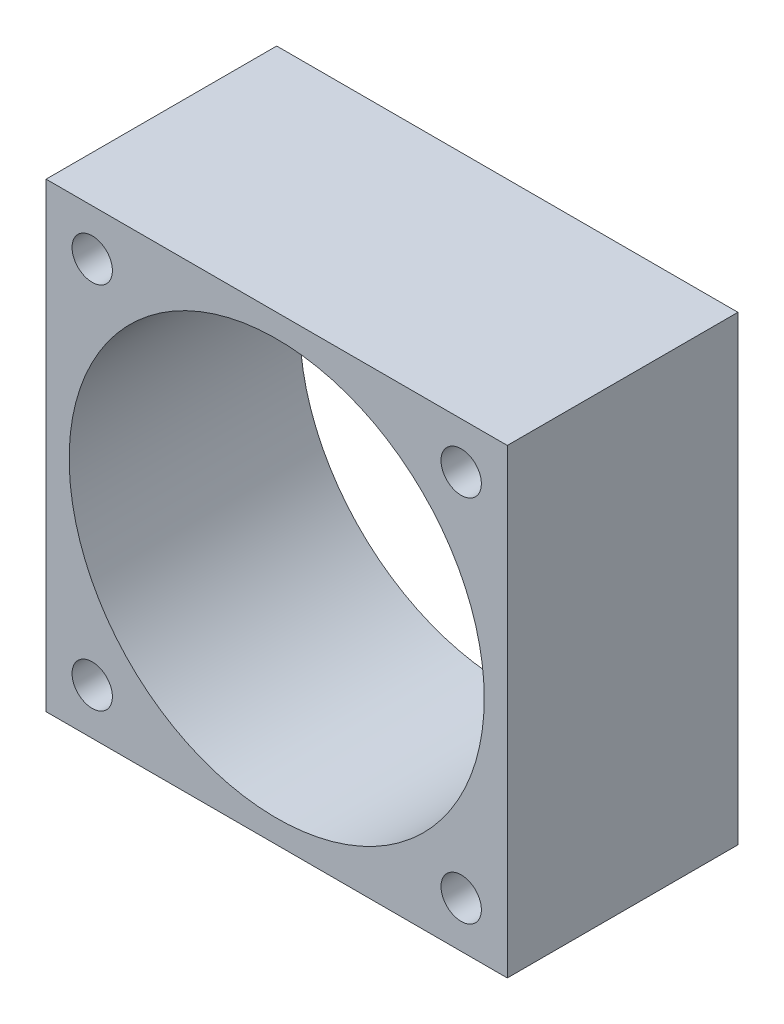
ISO-10303-21;
HEADER;
FILE_DESCRIPTION(('STEP AP214'),'2;1');
FILE_NAME('part.step','',(''),(''),'','','');
FILE_SCHEMA(('AUTOMOTIVE_DESIGN { 1 0 10303 214 1 1 1 1 }'));
ENDSEC;
DATA;
#1=APPLICATION_CONTEXT('core data for automotive mechanical design processes');
#2=APPLICATION_PROTOCOL_DEFINITION('international standard','automotive_design',2000,#1);
#3=PRODUCT_CONTEXT('',#1,'mechanical');
#4=PRODUCT('Part','Part','',(#3));
#5=PRODUCT_RELATED_PRODUCT_CATEGORY('part','',(#4));
#6=PRODUCT_DEFINITION_FORMATION('','',#4);
#7=PRODUCT_DEFINITION_CONTEXT('part definition',#1,'design');
#8=PRODUCT_DEFINITION('design','',#6,#7);
#9=PRODUCT_DEFINITION_SHAPE('','',#8);
#10=(LENGTH_UNIT() NAMED_UNIT(*) SI_UNIT(.MILLI.,.METRE.));
#11=(NAMED_UNIT(*) PLANE_ANGLE_UNIT() SI_UNIT($,.RADIAN.));
#12=(NAMED_UNIT(*) SI_UNIT($,.STERADIAN.) SOLID_ANGLE_UNIT());
#13=UNCERTAINTY_MEASURE_WITH_UNIT(LENGTH_MEASURE(1.E-05),#10,'distance_accuracy_value','');
#14=(GEOMETRIC_REPRESENTATION_CONTEXT(3) GLOBAL_UNCERTAINTY_ASSIGNED_CONTEXT((#13)) GLOBAL_UNIT_ASSIGNED_CONTEXT((#10,
#11,#12)) REPRESENTATION_CONTEXT('',''));
#15=CARTESIAN_POINT('',(0.,0.,0.));
#16=DIRECTION('',(0.,0.,1.));
#17=DIRECTION('',(1.,0.,0.));
#18=AXIS2_PLACEMENT_3D('',#15,#16,#17);
#19=CARTESIAN_POINT('',(0.,0.,20.));
#20=DIRECTION('',(0.,0.,-1.));
#21=DIRECTION('',(-1.,0.,0.));
#22=AXIS2_PLACEMENT_3D('',#19,#20,#21);
#23=PLANE('',#22);
#24=DIRECTION('',(0.,-1.,0.));
#25=VECTOR('',#24,1.);
#26=CARTESIAN_POINT('',(-30.,33.,20.));
#27=LINE('',#26,#25);
#28=CARTESIAN_POINT('',(-30.,73.,20.));
#29=VERTEX_POINT('',#28);
#30=CARTESIAN_POINT('',(-30.,33.,20.));
#31=VERTEX_POINT('',#30);
#32=EDGE_CURVE('E94',#29,#31,#27,.T.);
#33=ORIENTED_EDGE('',*,*,#32,.T.);
#34=DIRECTION('',(1.,0.,0.));
#35=VECTOR('',#34,1.);
#36=CARTESIAN_POINT('',(-30.,33.,20.));
#37=LINE('',#36,#35);
#38=CARTESIAN_POINT('',(10.,33.,20.));
#39=VERTEX_POINT('',#38);
#40=EDGE_CURVE('E90',#31,#39,#37,.T.);
#41=ORIENTED_EDGE('',*,*,#40,.T.);
#42=DIRECTION('',(0.,1.,0.));
#43=VECTOR('',#42,1.);
#44=CARTESIAN_POINT('',(10.,33.,20.));
#45=LINE('',#44,#43);
#46=CARTESIAN_POINT('',(10.,73.,20.));
#47=VERTEX_POINT('',#46);
#48=EDGE_CURVE('E92',#39,#47,#45,.T.);
#49=ORIENTED_EDGE('',*,*,#48,.T.);
#50=DIRECTION('',(-1.,0.,0.));
#51=VECTOR('',#50,1.);
#52=CARTESIAN_POINT('',(-30.,73.,20.));
#53=LINE('',#52,#51);
#54=EDGE_CURVE('E59',#47,#29,#53,.T.);
#55=ORIENTED_EDGE('',*,*,#54,.T.);
#56=EDGE_LOOP('',(#33,#41,#49,#55));
#57=FACE_BOUND('',#56,.T.);
#58=CARTESIAN_POINT('',(-10.,53.,20.));
#59=DIRECTION('',(0.,0.,1.));
#60=DIRECTION('',(1.,0.,0.));
#61=AXIS2_PLACEMENT_3D('',#58,#59,#60);
#62=CIRCLE('',#61,18.);
#63=CARTESIAN_POINT('',(8.,53.,20.));
#64=VERTEX_POINT('',#63);
#65=EDGE_CURVE('E108',#64,#64,#62,.T.);
#66=ORIENTED_EDGE('',*,*,#65,.F.);
#67=EDGE_LOOP('',(#66));
#68=FACE_BOUND('',#67,.T.);
#69=CARTESIAN_POINT('',(-26.,37.,20.));
#70=DIRECTION('',(0.,0.,1.));
#71=DIRECTION('',(1.,0.,0.));
#72=AXIS2_PLACEMENT_3D('',#69,#70,#71);
#73=CIRCLE('',#72,1.75);
#74=CARTESIAN_POINT('',(-24.25,37.,20.));
#75=VERTEX_POINT('',#74);
#76=EDGE_CURVE('E124',#75,#75,#73,.T.);
#77=ORIENTED_EDGE('',*,*,#76,.F.);
#78=EDGE_LOOP('',(#77));
#79=FACE_BOUND('',#78,.T.);
#80=CARTESIAN_POINT('',(-26.,69.,20.));
#81=DIRECTION('',(0.,0.,1.));
#82=DIRECTION('',(1.,0.,0.));
#83=AXIS2_PLACEMENT_3D('',#80,#81,#82);
#84=CIRCLE('',#83,1.75);
#85=CARTESIAN_POINT('',(-24.25,69.,20.));
#86=VERTEX_POINT('',#85);
#87=EDGE_CURVE('E126',#86,#86,#84,.T.);
#88=ORIENTED_EDGE('',*,*,#87,.F.);
#89=EDGE_LOOP('',(#88));
#90=FACE_BOUND('',#89,.T.);
#91=CARTESIAN_POINT('',(6.,37.,20.));
#92=DIRECTION('',(0.,0.,1.));
#93=DIRECTION('',(1.,0.,0.));
#94=AXIS2_PLACEMENT_3D('',#91,#92,#93);
#95=CIRCLE('',#94,1.75);
#96=CARTESIAN_POINT('',(7.75,37.,20.));
#97=VERTEX_POINT('',#96);
#98=EDGE_CURVE('E133',#97,#97,#95,.T.);
#99=ORIENTED_EDGE('',*,*,#98,.F.);
#100=EDGE_LOOP('',(#99));
#101=FACE_BOUND('',#100,.T.);
#102=CARTESIAN_POINT('',(6.,69.,20.));
#103=DIRECTION('',(0.,0.,1.));
#104=DIRECTION('',(1.,0.,0.));
#105=AXIS2_PLACEMENT_3D('',#102,#103,#104);
#106=CIRCLE('',#105,1.75);
#107=CARTESIAN_POINT('',(7.75,69.,20.));
#108=VERTEX_POINT('',#107);
#109=EDGE_CURVE('E142',#108,#108,#106,.T.);
#110=ORIENTED_EDGE('',*,*,#109,.F.);
#111=EDGE_LOOP('',(#110));
#112=FACE_BOUND('',#111,.T.);
#113=ADVANCED_FACE('F41',(#57,#68,#79,#90,#101,#112),#23,.F.);
#114=CARTESIAN_POINT('',(0.,0.,0.));
#115=DIRECTION('',(0.,0.,-1.));
#116=DIRECTION('',(-1.,0.,0.));
#117=AXIS2_PLACEMENT_3D('',#114,#115,#116);
#118=PLANE('',#117);
#119=CARTESIAN_POINT('',(6.,37.,0.));
#120=DIRECTION('',(0.,0.,1.));
#121=DIRECTION('',(1.,0.,0.));
#122=AXIS2_PLACEMENT_3D('',#119,#120,#121);
#123=CIRCLE('',#122,1.75);
#124=CARTESIAN_POINT('',(7.75,37.,0.));
#125=VERTEX_POINT('',#124);
#126=EDGE_CURVE('E139',#125,#125,#123,.T.);
#127=ORIENTED_EDGE('',*,*,#126,.T.);
#128=EDGE_LOOP('',(#127));
#129=FACE_BOUND('',#128,.T.);
#130=CARTESIAN_POINT('',(-26.,37.,0.));
#131=DIRECTION('',(0.,0.,1.));
#132=DIRECTION('',(1.,0.,0.));
#133=AXIS2_PLACEMENT_3D('',#130,#131,#132);
#134=CIRCLE('',#133,1.75);
#135=CARTESIAN_POINT('',(-24.25,37.,0.));
#136=VERTEX_POINT('',#135);
#137=EDGE_CURVE('E127',#136,#136,#134,.T.);
#138=ORIENTED_EDGE('',*,*,#137,.T.);
#139=EDGE_LOOP('',(#138));
#140=FACE_BOUND('',#139,.T.);
#141=DIRECTION('',(0.,-1.,0.));
#142=VECTOR('',#141,1.);
#143=CARTESIAN_POINT('',(-30.,33.,0.));
#144=LINE('',#143,#142);
#145=CARTESIAN_POINT('',(-30.,73.,0.));
#146=VERTEX_POINT('',#145);
#147=CARTESIAN_POINT('',(-30.,33.,0.));
#148=VERTEX_POINT('',#147);
#149=EDGE_CURVE('E102',#146,#148,#144,.T.);
#150=ORIENTED_EDGE('',*,*,#149,.F.);
#151=DIRECTION('',(-1.,0.,0.));
#152=VECTOR('',#151,1.);
#153=CARTESIAN_POINT('',(-30.,73.,0.));
#154=LINE('',#153,#152);
#155=CARTESIAN_POINT('',(10.,73.,0.));
#156=VERTEX_POINT('',#155);
#157=EDGE_CURVE('E82',#156,#146,#154,.T.);
#158=ORIENTED_EDGE('',*,*,#157,.F.);
#159=DIRECTION('',(0.,1.,0.));
#160=VECTOR('',#159,1.);
#161=CARTESIAN_POINT('',(10.,33.,0.));
#162=LINE('',#161,#160);
#163=CARTESIAN_POINT('',(10.,33.,0.));
#164=VERTEX_POINT('',#163);
#165=EDGE_CURVE('E73',#164,#156,#162,.T.);
#166=ORIENTED_EDGE('',*,*,#165,.F.);
#167=DIRECTION('',(1.,0.,0.));
#168=VECTOR('',#167,1.);
#169=CARTESIAN_POINT('',(-30.,33.,0.));
#170=LINE('',#169,#168);
#171=EDGE_CURVE('E97',#148,#164,#170,.T.);
#172=ORIENTED_EDGE('',*,*,#171,.F.);
#173=EDGE_LOOP('',(#150,#158,#166,#172));
#174=FACE_BOUND('',#173,.T.);
#175=CARTESIAN_POINT('',(-10.,53.,0.));
#176=DIRECTION('',(0.,0.,1.));
#177=DIRECTION('',(1.,0.,0.));
#178=AXIS2_PLACEMENT_3D('',#175,#176,#177);
#179=CIRCLE('',#178,18.);
#180=CARTESIAN_POINT('',(8.,53.,0.));
#181=VERTEX_POINT('',#180);
#182=EDGE_CURVE('E119',#181,#181,#179,.T.);
#183=ORIENTED_EDGE('',*,*,#182,.T.);
#184=EDGE_LOOP('',(#183));
#185=FACE_BOUND('',#184,.T.);
#186=CARTESIAN_POINT('',(-26.,69.,0.));
#187=DIRECTION('',(0.,0.,1.));
#188=DIRECTION('',(1.,0.,0.));
#189=AXIS2_PLACEMENT_3D('',#186,#187,#188);
#190=CIRCLE('',#189,1.75);
#191=CARTESIAN_POINT('',(-24.25,69.,0.));
#192=VERTEX_POINT('',#191);
#193=EDGE_CURVE('E134',#192,#192,#190,.T.);
#194=ORIENTED_EDGE('',*,*,#193,.T.);
#195=EDGE_LOOP('',(#194));
#196=FACE_BOUND('',#195,.T.);
#197=CARTESIAN_POINT('',(6.,69.,0.));
#198=DIRECTION('',(0.,0.,1.));
#199=DIRECTION('',(1.,0.,0.));
#200=AXIS2_PLACEMENT_3D('',#197,#198,#199);
#201=CIRCLE('',#200,1.75);
#202=CARTESIAN_POINT('',(7.75,69.,0.));
#203=VERTEX_POINT('',#202);
#204=EDGE_CURVE('E144',#203,#203,#201,.T.);
#205=ORIENTED_EDGE('',*,*,#204,.T.);
#206=EDGE_LOOP('',(#205));
#207=FACE_BOUND('',#206,.T.);
#208=ADVANCED_FACE('F116',(#129,#140,#174,#185,#196,#207),#118,.T.);
#209=CARTESIAN_POINT('',(-30.,33.,20.));
#210=DIRECTION('',(1.,0.,0.));
#211=DIRECTION('',(0.,0.,-1.));
#212=AXIS2_PLACEMENT_3D('',#209,#210,#211);
#213=PLANE('',#212);
#214=ORIENTED_EDGE('',*,*,#149,.T.);
#215=DIRECTION('',(0.,0.,-1.));
#216=VECTOR('',#215,1.);
#217=CARTESIAN_POINT('',(-30.,33.,20.));
#218=LINE('',#217,#216);
#219=EDGE_CURVE('E11',#31,#148,#218,.T.);
#220=ORIENTED_EDGE('',*,*,#219,.F.);
#221=ORIENTED_EDGE('',*,*,#32,.F.);
#222=DIRECTION('',(0.,0.,-1.));
#223=VECTOR('',#222,1.);
#224=CARTESIAN_POINT('',(-30.,73.,20.));
#225=LINE('',#224,#223);
#226=EDGE_CURVE('E103',#29,#146,#225,.T.);
#227=ORIENTED_EDGE('',*,*,#226,.T.);
#228=EDGE_LOOP('',(#214,#220,#221,#227));
#229=FACE_BOUND('',#228,.T.);
#230=ADVANCED_FACE('F43',(#229),#213,.F.);
#231=CARTESIAN_POINT('',(-30.,33.,20.));
#232=DIRECTION('',(0.,1.,0.));
#233=DIRECTION('',(0.,0.,1.));
#234=AXIS2_PLACEMENT_3D('',#231,#232,#233);
#235=PLANE('',#234);
#236=ORIENTED_EDGE('',*,*,#171,.T.);
#237=DIRECTION('',(0.,0.,-1.));
#238=VECTOR('',#237,1.);
#239=CARTESIAN_POINT('',(10.,33.,20.));
#240=LINE('',#239,#238);
#241=EDGE_CURVE('E49',#39,#164,#240,.T.);
#242=ORIENTED_EDGE('',*,*,#241,.F.);
#243=ORIENTED_EDGE('',*,*,#40,.F.);
#244=ORIENTED_EDGE('',*,*,#219,.T.);
#245=EDGE_LOOP('',(#236,#242,#243,#244));
#246=FACE_BOUND('',#245,.T.);
#247=ADVANCED_FACE('F98',(#246),#235,.F.);
#248=CARTESIAN_POINT('',(10.,33.,20.));
#249=DIRECTION('',(-1.,0.,0.));
#250=DIRECTION('',(0.,0.,1.));
#251=AXIS2_PLACEMENT_3D('',#248,#249,#250);
#252=PLANE('',#251);
#253=ORIENTED_EDGE('',*,*,#165,.T.);
#254=DIRECTION('',(0.,0.,-1.));
#255=VECTOR('',#254,1.);
#256=CARTESIAN_POINT('',(10.,73.,20.));
#257=LINE('',#256,#255);
#258=EDGE_CURVE('E96',#47,#156,#257,.T.);
#259=ORIENTED_EDGE('',*,*,#258,.F.);
#260=ORIENTED_EDGE('',*,*,#48,.F.);
#261=ORIENTED_EDGE('',*,*,#241,.T.);
#262=EDGE_LOOP('',(#253,#259,#260,#261));
#263=FACE_BOUND('',#262,.T.);
#264=ADVANCED_FACE('F100',(#263),#252,.F.);
#265=CARTESIAN_POINT('',(-30.,73.,20.));
#266=DIRECTION('',(0.,-1.,0.));
#267=DIRECTION('',(0.,0.,-1.));
#268=AXIS2_PLACEMENT_3D('',#265,#266,#267);
#269=PLANE('',#268);
#270=ORIENTED_EDGE('',*,*,#157,.T.);
#271=ORIENTED_EDGE('',*,*,#226,.F.);
#272=ORIENTED_EDGE('',*,*,#54,.F.);
#273=ORIENTED_EDGE('',*,*,#258,.T.);
#274=EDGE_LOOP('',(#270,#271,#272,#273));
#275=FACE_BOUND('',#274,.T.);
#276=ADVANCED_FACE('F113',(#275),#269,.F.);
#277=CARTESIAN_POINT('',(-10.,53.,20.));
#278=DIRECTION('',(0.,0.,-1.));
#279=DIRECTION('',(-1.,0.,0.));
#280=AXIS2_PLACEMENT_3D('',#277,#278,#279);
#281=CYLINDRICAL_SURFACE('',#280,18.);
#282=ORIENTED_EDGE('',*,*,#65,.T.);
#283=EDGE_LOOP('',(#282));
#284=FACE_BOUND('',#283,.T.);
#285=ORIENTED_EDGE('',*,*,#182,.F.);
#286=EDGE_LOOP('',(#285));
#287=FACE_BOUND('',#286,.T.);
#288=ADVANCED_FACE('F163',(#284,#287),#281,.F.);
#289=CARTESIAN_POINT('',(-26.,37.,20.));
#290=DIRECTION('',(0.,0.,-1.));
#291=DIRECTION('',(-1.,0.,0.));
#292=AXIS2_PLACEMENT_3D('',#289,#290,#291);
#293=CYLINDRICAL_SURFACE('',#292,1.75);
#294=ORIENTED_EDGE('',*,*,#76,.T.);
#295=EDGE_LOOP('',(#294));
#296=FACE_BOUND('',#295,.T.);
#297=ORIENTED_EDGE('',*,*,#137,.F.);
#298=EDGE_LOOP('',(#297));
#299=FACE_BOUND('',#298,.T.);
#300=ADVANCED_FACE('F207',(#296,#299),#293,.F.);
#301=CARTESIAN_POINT('',(-26.,69.,20.));
#302=DIRECTION('',(0.,0.,-1.));
#303=DIRECTION('',(-1.,0.,0.));
#304=AXIS2_PLACEMENT_3D('',#301,#302,#303);
#305=CYLINDRICAL_SURFACE('',#304,1.75);
#306=ORIENTED_EDGE('',*,*,#87,.T.);
#307=EDGE_LOOP('',(#306));
#308=FACE_BOUND('',#307,.T.);
#309=ORIENTED_EDGE('',*,*,#193,.F.);
#310=EDGE_LOOP('',(#309));
#311=FACE_BOUND('',#310,.T.);
#312=ADVANCED_FACE('F211',(#308,#311),#305,.F.);
#313=CARTESIAN_POINT('',(6.,37.,20.));
#314=DIRECTION('',(0.,0.,-1.));
#315=DIRECTION('',(-1.,0.,0.));
#316=AXIS2_PLACEMENT_3D('',#313,#314,#315);
#317=CYLINDRICAL_SURFACE('',#316,1.75);
#318=ORIENTED_EDGE('',*,*,#98,.T.);
#319=EDGE_LOOP('',(#318));
#320=FACE_BOUND('',#319,.T.);
#321=ORIENTED_EDGE('',*,*,#126,.F.);
#322=EDGE_LOOP('',(#321));
#323=FACE_BOUND('',#322,.T.);
#324=ADVANCED_FACE('F225',(#320,#323),#317,.F.);
#325=CARTESIAN_POINT('',(6.,69.,20.));
#326=DIRECTION('',(0.,0.,-1.));
#327=DIRECTION('',(-1.,0.,0.));
#328=AXIS2_PLACEMENT_3D('',#325,#326,#327);
#329=CYLINDRICAL_SURFACE('',#328,1.75);
#330=ORIENTED_EDGE('',*,*,#109,.T.);
#331=EDGE_LOOP('',(#330));
#332=FACE_BOUND('',#331,.T.);
#333=ORIENTED_EDGE('',*,*,#204,.F.);
#334=EDGE_LOOP('',(#333));
#335=FACE_BOUND('',#334,.T.);
#336=ADVANCED_FACE('F148',(#332,#335),#329,.F.);
#337=CLOSED_SHELL('',(#113,#208,#230,#247,#264,#276,#288,#300,#312,#324,#336));
#338=MANIFOLD_SOLID_BREP('B2',#337);
#339=ADVANCED_BREP_SHAPE_REPRESENTATION('',(#18,#338),#14);
#340=SHAPE_DEFINITION_REPRESENTATION(#9,#339);
ENDSEC;
END-ISO-10303-21;
